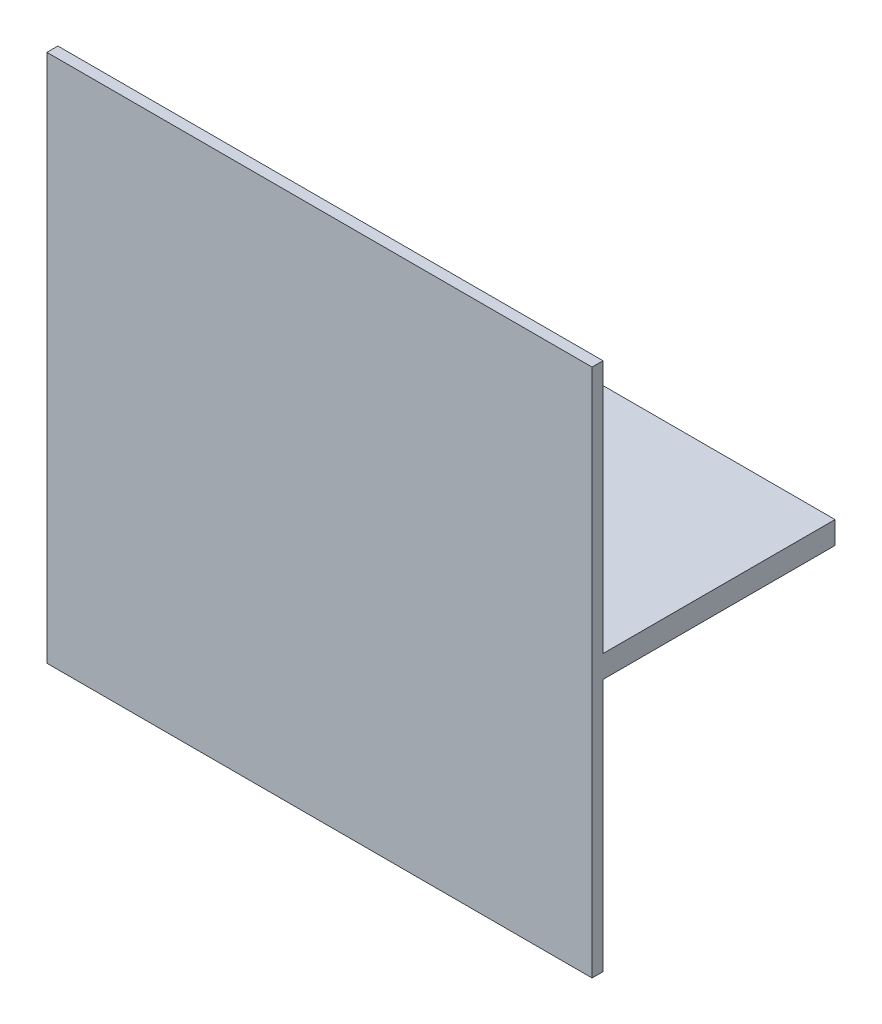
ISO-10303-21;
HEADER;
FILE_DESCRIPTION(('STEP AP214'),'2;1');
FILE_NAME('part.step','',(''),(''),'','','');
FILE_SCHEMA(('AUTOMOTIVE_DESIGN { 1 0 10303 214 1 1 1 1 }'));
ENDSEC;
DATA;
#1=APPLICATION_CONTEXT('core data for automotive mechanical design processes');
#2=APPLICATION_PROTOCOL_DEFINITION('international standard','automotive_design',2000,#1);
#3=PRODUCT_CONTEXT('',#1,'mechanical');
#4=PRODUCT('Part','Part','',(#3));
#5=PRODUCT_RELATED_PRODUCT_CATEGORY('part','',(#4));
#6=PRODUCT_DEFINITION_FORMATION('','',#4);
#7=PRODUCT_DEFINITION_CONTEXT('part definition',#1,'design');
#8=PRODUCT_DEFINITION('design','',#6,#7);
#9=PRODUCT_DEFINITION_SHAPE('','',#8);
#10=(LENGTH_UNIT() NAMED_UNIT(*) SI_UNIT(.MILLI.,.METRE.));
#11=(NAMED_UNIT(*) PLANE_ANGLE_UNIT() SI_UNIT($,.RADIAN.));
#12=(NAMED_UNIT(*) SI_UNIT($,.STERADIAN.) SOLID_ANGLE_UNIT());
#13=UNCERTAINTY_MEASURE_WITH_UNIT(LENGTH_MEASURE(1.E-05),#10,'distance_accuracy_value','');
#14=(GEOMETRIC_REPRESENTATION_CONTEXT(3) GLOBAL_UNCERTAINTY_ASSIGNED_CONTEXT((#13)) GLOBAL_UNIT_ASSIGNED_CONTEXT((#10,
#11,#12)) REPRESENTATION_CONTEXT('',''));
#15=CARTESIAN_POINT('',(0.,0.,0.));
#16=DIRECTION('',(0.,0.,1.));
#17=DIRECTION('',(1.,0.,0.));
#18=AXIS2_PLACEMENT_3D('',#15,#16,#17);
#19=CARTESIAN_POINT('',(-1101.60894308943,241.3,-165.746666666667));
#20=DIRECTION('',(0.,0.,1.));
#21=DIRECTION('',(1.,0.,0.));
#22=AXIS2_PLACEMENT_3D('',#19,#20,#21);
#23=PLANE('',#22);
#24=DIRECTION('',(-1.,0.,0.));
#25=VECTOR('',#24,1.);
#26=CARTESIAN_POINT('',(-1101.60894308943,115.412342914901,-165.746666666667));
#27=LINE('',#26,#25);
#28=CARTESIAN_POINT('',(-852.988943089431,115.412342914901,-165.746666666667));
#29=VERTEX_POINT('',#28);
#30=CARTESIAN_POINT('',(-1101.60894308943,115.412342914901,-165.746666666667));
#31=VERTEX_POINT('',#30);
#32=EDGE_CURVE('E63',#29,#31,#27,.T.);
#33=ORIENTED_EDGE('',*,*,#32,.F.);
#34=DIRECTION('',(0.,-1.,0.));
#35=VECTOR('',#34,1.);
#36=CARTESIAN_POINT('',(-852.988943089431,241.3,-165.746666666667));
#37=LINE('',#36,#35);
#38=CARTESIAN_POINT('',(-852.988943089431,0.,-165.746666666667));
#39=VERTEX_POINT('',#38);
#40=EDGE_CURVE('E249',#29,#39,#37,.T.);
#41=ORIENTED_EDGE('',*,*,#40,.T.);
#42=DIRECTION('',(-1.,0.,0.));
#43=VECTOR('',#42,1.);
#44=CARTESIAN_POINT('',(-1101.60894308943,0.,-165.746666666667));
#45=LINE('',#44,#43);
#46=CARTESIAN_POINT('',(-1101.60894308943,0.,-165.746666666667));
#47=VERTEX_POINT('',#46);
#48=EDGE_CURVE('E222',#39,#47,#45,.T.);
#49=ORIENTED_EDGE('',*,*,#48,.T.);
#50=DIRECTION('',(0.,-1.,0.));
#51=VECTOR('',#50,1.);
#52=CARTESIAN_POINT('',(-1101.60894308943,241.3,-165.746666666667));
#53=LINE('',#52,#51);
#54=EDGE_CURVE('E231',#31,#47,#53,.T.);
#55=ORIENTED_EDGE('',*,*,#54,.F.);
#56=EDGE_LOOP('',(#33,#41,#49,#55));
#57=FACE_BOUND('',#56,.T.);
#58=ADVANCED_FACE('F39',(#57),#23,.F.);
#59=DIRECTION('',(1.,0.,0.));
#60=VECTOR('',#59,1.);
#61=CARTESIAN_POINT('',(-1101.60894308943,125.65,-165.746666666667));
#62=LINE('',#61,#60);
#63=CARTESIAN_POINT('',(-1101.60894308943,125.65,-165.746666666667));
#64=VERTEX_POINT('',#63);
#65=CARTESIAN_POINT('',(-852.988943089431,125.65,-165.746666666667));
#66=VERTEX_POINT('',#65);
#67=EDGE_CURVE('E149',#64,#66,#62,.T.);
#68=ORIENTED_EDGE('',*,*,#67,.F.);
#69=CARTESIAN_POINT('',(-1101.60894308943,241.3,-165.746666666667));
#70=VERTEX_POINT('',#69);
#71=EDGE_CURVE('E245',#70,#64,#53,.T.);
#72=ORIENTED_EDGE('',*,*,#71,.F.);
#73=DIRECTION('',(-1.,0.,0.));
#74=VECTOR('',#73,1.);
#75=CARTESIAN_POINT('',(-1101.60894308943,241.3,-165.746666666667));
#76=LINE('',#75,#74);
#77=CARTESIAN_POINT('',(-852.988943089431,241.3,-165.746666666667));
#78=VERTEX_POINT('',#77);
#79=EDGE_CURVE('E228',#78,#70,#76,.T.);
#80=ORIENTED_EDGE('',*,*,#79,.F.);
#81=EDGE_CURVE('E250',#78,#66,#37,.T.);
#82=ORIENTED_EDGE('',*,*,#81,.T.);
#83=EDGE_LOOP('',(#68,#72,#80,#82));
#84=FACE_BOUND('',#83,.T.);
#85=ADVANCED_FACE('F283',(#84),#23,.F.);
#86=CARTESIAN_POINT('',(-1101.60894308943,241.3,-160.746666666667));
#87=DIRECTION('',(1.,0.,0.));
#88=DIRECTION('',(0.,0.,-1.));
#89=AXIS2_PLACEMENT_3D('',#86,#87,#88);
#90=PLANE('',#89);
#91=DIRECTION('',(0.,0.,1.));
#92=VECTOR('',#91,1.);
#93=CARTESIAN_POINT('',(-1101.60894308943,0.,-160.746666666667));
#94=LINE('',#93,#92);
#95=CARTESIAN_POINT('',(-1101.60894308943,0.,-160.746666666667));
#96=VERTEX_POINT('',#95);
#97=EDGE_CURVE('E216',#47,#96,#94,.T.);
#98=ORIENTED_EDGE('',*,*,#97,.T.);
#99=DIRECTION('',(0.,-1.,0.));
#100=VECTOR('',#99,1.);
#101=CARTESIAN_POINT('',(-1101.60894308943,241.3,-160.746666666667));
#102=LINE('',#101,#100);
#103=CARTESIAN_POINT('',(-1101.60894308943,241.3,-160.746666666667));
#104=VERTEX_POINT('',#103);
#105=EDGE_CURVE('E11',#104,#96,#102,.T.);
#106=ORIENTED_EDGE('',*,*,#105,.F.);
#107=DIRECTION('',(0.,0.,1.));
#108=VECTOR('',#107,1.);
#109=CARTESIAN_POINT('',(-1101.60894308943,241.3,-160.746666666667));
#110=LINE('',#109,#108);
#111=EDGE_CURVE('E217',#70,#104,#110,.T.);
#112=ORIENTED_EDGE('',*,*,#111,.F.);
#113=ORIENTED_EDGE('',*,*,#71,.T.);
#114=DIRECTION('',(0.,0.,1.));
#115=VECTOR('',#114,1.);
#116=CARTESIAN_POINT('',(-1101.60894308943,125.65,-271.586666666667));
#117=LINE('',#116,#115);
#118=CARTESIAN_POINT('',(-1101.60894308943,125.65,-271.586666666667));
#119=VERTEX_POINT('',#118);
#120=EDGE_CURVE('E212',#119,#64,#117,.T.);
#121=ORIENTED_EDGE('',*,*,#120,.F.);
#122=DIRECTION('',(0.,1.,0.));
#123=VECTOR('',#122,1.);
#124=CARTESIAN_POINT('',(-1101.60894308943,125.65,-271.586666666667));
#125=LINE('',#124,#123);
#126=CARTESIAN_POINT('',(-1101.60894308943,115.412342914901,-271.586666666667));
#127=VERTEX_POINT('',#126);
#128=EDGE_CURVE('E182',#127,#119,#125,.T.);
#129=ORIENTED_EDGE('',*,*,#128,.F.);
#130=DIRECTION('',(0.,0.,1.));
#131=VECTOR('',#130,1.);
#132=CARTESIAN_POINT('',(-1101.60894308943,115.412342914901,-271.586666666667));
#133=LINE('',#132,#131);
#134=EDGE_CURVE('E195',#127,#31,#133,.T.);
#135=ORIENTED_EDGE('',*,*,#134,.T.);
#136=ORIENTED_EDGE('',*,*,#54,.T.);
#137=EDGE_LOOP('',(#98,#106,#112,#113,#121,#129,#135,#136));
#138=FACE_BOUND('',#137,.T.);
#139=ADVANCED_FACE('F41',(#138),#90,.F.);
#140=CARTESIAN_POINT('',(-1101.60894308943,241.3,-160.746666666667));
#141=DIRECTION('',(0.,0.,-1.));
#142=DIRECTION('',(-1.,0.,0.));
#143=AXIS2_PLACEMENT_3D('',#140,#141,#142);
#144=PLANE('',#143);
#145=DIRECTION('',(1.,0.,0.));
#146=VECTOR('',#145,1.);
#147=CARTESIAN_POINT('',(-1101.60894308943,0.,-160.746666666667));
#148=LINE('',#147,#146);
#149=CARTESIAN_POINT('',(-852.988943089431,0.,-160.746666666667));
#150=VERTEX_POINT('',#149);
#151=EDGE_CURVE('E235',#96,#150,#148,.T.);
#152=ORIENTED_EDGE('',*,*,#151,.T.);
#153=DIRECTION('',(0.,-1.,0.));
#154=VECTOR('',#153,1.);
#155=CARTESIAN_POINT('',(-852.988943089431,241.3,-160.746666666667));
#156=LINE('',#155,#154);
#157=CARTESIAN_POINT('',(-852.988943089431,241.3,-160.746666666667));
#158=VERTEX_POINT('',#157);
#159=EDGE_CURVE('E48',#158,#150,#156,.T.);
#160=ORIENTED_EDGE('',*,*,#159,.F.);
#161=DIRECTION('',(1.,0.,0.));
#162=VECTOR('',#161,1.);
#163=CARTESIAN_POINT('',(-1101.60894308943,241.3,-160.746666666667));
#164=LINE('',#163,#162);
#165=EDGE_CURVE('E221',#104,#158,#164,.T.);
#166=ORIENTED_EDGE('',*,*,#165,.F.);
#167=ORIENTED_EDGE('',*,*,#105,.T.);
#168=EDGE_LOOP('',(#152,#160,#166,#167));
#169=FACE_BOUND('',#168,.T.);
#170=ADVANCED_FACE('F288',(#169),#144,.F.);
#171=CARTESIAN_POINT('',(-852.988943089431,241.3,-160.746666666667));
#172=DIRECTION('',(-1.,0.,0.));
#173=DIRECTION('',(0.,0.,1.));
#174=AXIS2_PLACEMENT_3D('',#171,#172,#173);
#175=PLANE('',#174);
#176=DIRECTION('',(0.,0.,-1.));
#177=VECTOR('',#176,1.);
#178=CARTESIAN_POINT('',(-852.988943089431,0.,-160.746666666667));
#179=LINE('',#178,#177);
#180=EDGE_CURVE('E238',#150,#39,#179,.T.);
#181=ORIENTED_EDGE('',*,*,#180,.T.);
#182=ORIENTED_EDGE('',*,*,#40,.F.);
#183=DIRECTION('',(0.,0.,1.));
#184=VECTOR('',#183,1.);
#185=CARTESIAN_POINT('',(-852.988943089431,115.412342914901,-271.586666666667));
#186=LINE('',#185,#184);
#187=CARTESIAN_POINT('',(-852.988943089431,115.412342914901,-271.586666666667));
#188=VERTEX_POINT('',#187);
#189=EDGE_CURVE('E204',#188,#29,#186,.T.);
#190=ORIENTED_EDGE('',*,*,#189,.F.);
#191=DIRECTION('',(0.,-1.,0.));
#192=VECTOR('',#191,1.);
#193=CARTESIAN_POINT('',(-852.988943089431,125.65,-271.586666666667));
#194=LINE('',#193,#192);
#195=CARTESIAN_POINT('',(-852.988943089431,125.65,-271.586666666667));
#196=VERTEX_POINT('',#195);
#197=EDGE_CURVE('E189',#196,#188,#194,.T.);
#198=ORIENTED_EDGE('',*,*,#197,.F.);
#199=DIRECTION('',(0.,0.,1.));
#200=VECTOR('',#199,1.);
#201=CARTESIAN_POINT('',(-852.988943089431,125.65,-271.586666666667));
#202=LINE('',#201,#200);
#203=EDGE_CURVE('E208',#196,#66,#202,.T.);
#204=ORIENTED_EDGE('',*,*,#203,.T.);
#205=ORIENTED_EDGE('',*,*,#81,.F.);
#206=DIRECTION('',(0.,0.,-1.));
#207=VECTOR('',#206,1.);
#208=CARTESIAN_POINT('',(-852.988943089431,241.3,-160.746666666667));
#209=LINE('',#208,#207);
#210=EDGE_CURVE('E225',#158,#78,#209,.T.);
#211=ORIENTED_EDGE('',*,*,#210,.F.);
#212=ORIENTED_EDGE('',*,*,#159,.T.);
#213=EDGE_LOOP('',(#181,#182,#190,#198,#204,#205,#211,#212));
#214=FACE_BOUND('',#213,.T.);
#215=ADVANCED_FACE('F258',(#214),#175,.F.);
#216=CARTESIAN_POINT('',(0.,241.3,0.));
#217=DIRECTION('',(0.,-1.,0.));
#218=DIRECTION('',(0.,0.,-1.));
#219=AXIS2_PLACEMENT_3D('',#216,#217,#218);
#220=PLANE('',#219);
#221=ORIENTED_EDGE('',*,*,#111,.T.);
#222=ORIENTED_EDGE('',*,*,#165,.T.);
#223=ORIENTED_EDGE('',*,*,#210,.T.);
#224=ORIENTED_EDGE('',*,*,#79,.T.);
#225=EDGE_LOOP('',(#221,#222,#223,#224));
#226=FACE_BOUND('',#225,.T.);
#227=ADVANCED_FACE('F287',(#226),#220,.F.);
#228=CARTESIAN_POINT('',(0.,0.,0.));
#229=DIRECTION('',(0.,-1.,0.));
#230=DIRECTION('',(0.,0.,-1.));
#231=AXIS2_PLACEMENT_3D('',#228,#229,#230);
#232=PLANE('',#231);
#233=ORIENTED_EDGE('',*,*,#97,.F.);
#234=ORIENTED_EDGE('',*,*,#48,.F.);
#235=ORIENTED_EDGE('',*,*,#180,.F.);
#236=ORIENTED_EDGE('',*,*,#151,.F.);
#237=EDGE_LOOP('',(#233,#234,#235,#236));
#238=FACE_BOUND('',#237,.T.);
#239=ADVANCED_FACE('F264',(#238),#232,.T.);
#240=CARTESIAN_POINT('',(0.,0.,-271.586666666667));
#241=DIRECTION('',(0.,0.,1.));
#242=DIRECTION('',(1.,0.,0.));
#243=AXIS2_PLACEMENT_3D('',#240,#241,#242);
#244=PLANE('',#243);
#245=ORIENTED_EDGE('',*,*,#128,.T.);
#246=DIRECTION('',(1.,0.,0.));
#247=VECTOR('',#246,1.);
#248=CARTESIAN_POINT('',(-1101.60894308943,125.65,-271.586666666667));
#249=LINE('',#248,#247);
#250=EDGE_CURVE('E186',#119,#196,#249,.T.);
#251=ORIENTED_EDGE('',*,*,#250,.T.);
#252=ORIENTED_EDGE('',*,*,#197,.T.);
#253=DIRECTION('',(-1.,0.,0.));
#254=VECTOR('',#253,1.);
#255=CARTESIAN_POINT('',(-1101.60894308943,115.412342914901,-271.586666666667));
#256=LINE('',#255,#254);
#257=EDGE_CURVE('E192',#188,#127,#256,.T.);
#258=ORIENTED_EDGE('',*,*,#257,.T.);
#259=EDGE_LOOP('',(#245,#251,#252,#258));
#260=FACE_BOUND('',#259,.T.);
#261=DIRECTION('',(0.,1.,0.));
#262=VECTOR('',#261,1.);
#263=CARTESIAN_POINT('',(-1091.60894308943,122.15,-271.586666666667));
#264=LINE('',#263,#262);
#265=CARTESIAN_POINT('',(-1091.60894308943,118.912342914901,-271.586666666667));
#266=VERTEX_POINT('',#265);
#267=CARTESIAN_POINT('',(-1091.60894308943,122.15,-271.586666666667));
#268=VERTEX_POINT('',#267);
#269=EDGE_CURVE('E131',#266,#268,#264,.T.);
#270=ORIENTED_EDGE('',*,*,#269,.F.);
#271=DIRECTION('',(-1.,0.,0.));
#272=VECTOR('',#271,1.);
#273=CARTESIAN_POINT('',(-1091.60894308943,118.912342914901,-271.586666666667));
#274=LINE('',#273,#272);
#275=CARTESIAN_POINT('',(-862.988943089431,118.912342914901,-271.586666666667));
#276=VERTEX_POINT('',#275);
#277=EDGE_CURVE('E159',#276,#266,#274,.T.);
#278=ORIENTED_EDGE('',*,*,#277,.F.);
#279=DIRECTION('',(0.,-1.,0.));
#280=VECTOR('',#279,1.);
#281=CARTESIAN_POINT('',(-862.988943089431,122.15,-271.586666666667));
#282=LINE('',#281,#280);
#283=CARTESIAN_POINT('',(-862.988943089431,122.15,-271.586666666667));
#284=VERTEX_POINT('',#283);
#285=EDGE_CURVE('E155',#284,#276,#282,.T.);
#286=ORIENTED_EDGE('',*,*,#285,.F.);
#287=DIRECTION('',(1.,0.,0.));
#288=VECTOR('',#287,1.);
#289=CARTESIAN_POINT('',(-1091.60894308943,122.15,-271.586666666667));
#290=LINE('',#289,#288);
#291=EDGE_CURVE('E141',#268,#284,#290,.T.);
#292=ORIENTED_EDGE('',*,*,#291,.F.);
#293=EDGE_LOOP('',(#270,#278,#286,#292));
#294=FACE_BOUND('',#293,.T.);
#295=ADVANCED_FACE('F153',(#260,#294),#244,.F.);
#296=CARTESIAN_POINT('',(-1101.60894308943,125.65,-271.586666666667));
#297=DIRECTION('',(0.,-1.,0.));
#298=DIRECTION('',(0.,0.,-1.));
#299=AXIS2_PLACEMENT_3D('',#296,#297,#298);
#300=PLANE('',#299);
#301=ORIENTED_EDGE('',*,*,#67,.T.);
#302=ORIENTED_EDGE('',*,*,#203,.F.);
#303=ORIENTED_EDGE('',*,*,#250,.F.);
#304=ORIENTED_EDGE('',*,*,#120,.T.);
#305=EDGE_LOOP('',(#301,#302,#303,#304));
#306=FACE_BOUND('',#305,.T.);
#307=ADVANCED_FACE('F280',(#306),#300,.F.);
#308=CARTESIAN_POINT('',(-1101.60894308943,115.412342914901,-271.586666666667));
#309=DIRECTION('',(0.,1.,0.));
#310=DIRECTION('',(0.,0.,1.));
#311=AXIS2_PLACEMENT_3D('',#308,#309,#310);
#312=PLANE('',#311);
#313=ORIENTED_EDGE('',*,*,#32,.T.);
#314=ORIENTED_EDGE('',*,*,#134,.F.);
#315=ORIENTED_EDGE('',*,*,#257,.F.);
#316=ORIENTED_EDGE('',*,*,#189,.T.);
#317=EDGE_LOOP('',(#313,#314,#315,#316));
#318=FACE_BOUND('',#317,.T.);
#319=ADVANCED_FACE('F275',(#318),#312,.F.);
#320=CARTESIAN_POINT('',(-1091.60894308943,122.15,-271.586666666667));
#321=DIRECTION('',(1.,0.,0.));
#322=DIRECTION('',(0.,0.,-1.));
#323=AXIS2_PLACEMENT_3D('',#320,#321,#322);
#324=PLANE('',#323);
#325=DIRECTION('',(0.,1.,0.));
#326=VECTOR('',#325,1.);
#327=CARTESIAN_POINT('',(-1091.60894308943,122.15,-165.746666666667));
#328=LINE('',#327,#326);
#329=CARTESIAN_POINT('',(-1091.60894308943,118.912342914901,-165.746666666667));
#330=VERTEX_POINT('',#329);
#331=CARTESIAN_POINT('',(-1091.60894308943,122.15,-165.746666666667));
#332=VERTEX_POINT('',#331);
#333=EDGE_CURVE('E164',#330,#332,#328,.T.);
#334=ORIENTED_EDGE('',*,*,#333,.F.);
#335=DIRECTION('',(0.,0.,1.));
#336=VECTOR('',#335,1.);
#337=CARTESIAN_POINT('',(-1091.60894308943,118.912342914901,-271.586666666667));
#338=LINE('',#337,#336);
#339=EDGE_CURVE('E136',#266,#330,#338,.T.);
#340=ORIENTED_EDGE('',*,*,#339,.F.);
#341=ORIENTED_EDGE('',*,*,#269,.T.);
#342=DIRECTION('',(0.,0.,1.));
#343=VECTOR('',#342,1.);
#344=CARTESIAN_POINT('',(-1091.60894308943,122.15,-271.586666666667));
#345=LINE('',#344,#343);
#346=EDGE_CURVE('E134',#268,#332,#345,.T.);
#347=ORIENTED_EDGE('',*,*,#346,.T.);
#348=EDGE_LOOP('',(#334,#340,#341,#347));
#349=FACE_BOUND('',#348,.T.);
#350=ADVANCED_FACE('F133',(#349),#324,.T.);
#351=CARTESIAN_POINT('',(-1091.60894308943,122.15,-271.586666666667));
#352=DIRECTION('',(0.,-1.,0.));
#353=DIRECTION('',(0.,0.,-1.));
#354=AXIS2_PLACEMENT_3D('',#351,#352,#353);
#355=PLANE('',#354);
#356=DIRECTION('',(1.,0.,0.));
#357=VECTOR('',#356,1.);
#358=CARTESIAN_POINT('',(-1091.60894308943,122.15,-165.746666666667));
#359=LINE('',#358,#357);
#360=CARTESIAN_POINT('',(-862.988943089431,122.15,-165.746666666667));
#361=VERTEX_POINT('',#360);
#362=EDGE_CURVE('E147',#332,#361,#359,.T.);
#363=ORIENTED_EDGE('',*,*,#362,.F.);
#364=ORIENTED_EDGE('',*,*,#346,.F.);
#365=ORIENTED_EDGE('',*,*,#291,.T.);
#366=DIRECTION('',(0.,0.,1.));
#367=VECTOR('',#366,1.);
#368=CARTESIAN_POINT('',(-862.988943089431,122.15,-271.586666666667));
#369=LINE('',#368,#367);
#370=EDGE_CURVE('E150',#284,#361,#369,.T.);
#371=ORIENTED_EDGE('',*,*,#370,.T.);
#372=EDGE_LOOP('',(#363,#364,#365,#371));
#373=FACE_BOUND('',#372,.T.);
#374=ADVANCED_FACE('F144',(#373),#355,.T.);
#375=CARTESIAN_POINT('',(-862.988943089431,122.15,-271.586666666667));
#376=DIRECTION('',(-1.,0.,0.));
#377=DIRECTION('',(0.,0.,1.));
#378=AXIS2_PLACEMENT_3D('',#375,#376,#377);
#379=PLANE('',#378);
#380=DIRECTION('',(0.,-1.,0.));
#381=VECTOR('',#380,1.);
#382=CARTESIAN_POINT('',(-862.988943089431,122.15,-165.746666666667));
#383=LINE('',#382,#381);
#384=CARTESIAN_POINT('',(-862.988943089431,118.912342914901,-165.746666666667));
#385=VERTEX_POINT('',#384);
#386=EDGE_CURVE('E169',#361,#385,#383,.T.);
#387=ORIENTED_EDGE('',*,*,#386,.F.);
#388=ORIENTED_EDGE('',*,*,#370,.F.);
#389=ORIENTED_EDGE('',*,*,#285,.T.);
#390=DIRECTION('',(0.,0.,1.));
#391=VECTOR('',#390,1.);
#392=CARTESIAN_POINT('',(-862.988943089431,118.912342914901,-271.586666666667));
#393=LINE('',#392,#391);
#394=EDGE_CURVE('E177',#276,#385,#393,.T.);
#395=ORIENTED_EDGE('',*,*,#394,.T.);
#396=EDGE_LOOP('',(#387,#388,#389,#395));
#397=FACE_BOUND('',#396,.T.);
#398=ADVANCED_FACE('F308',(#397),#379,.T.);
#399=CARTESIAN_POINT('',(-1091.60894308943,118.912342914901,-271.586666666667));
#400=DIRECTION('',(0.,1.,0.));
#401=DIRECTION('',(0.,0.,1.));
#402=AXIS2_PLACEMENT_3D('',#399,#400,#401);
#403=PLANE('',#402);
#404=DIRECTION('',(-1.,0.,0.));
#405=VECTOR('',#404,1.);
#406=CARTESIAN_POINT('',(-1091.60894308943,118.912342914901,-165.746666666667));
#407=LINE('',#406,#405);
#408=EDGE_CURVE('E55',#385,#330,#407,.T.);
#409=ORIENTED_EDGE('',*,*,#408,.F.);
#410=ORIENTED_EDGE('',*,*,#394,.F.);
#411=ORIENTED_EDGE('',*,*,#277,.T.);
#412=ORIENTED_EDGE('',*,*,#339,.T.);
#413=EDGE_LOOP('',(#409,#410,#411,#412));
#414=FACE_BOUND('',#413,.T.);
#415=ADVANCED_FACE('F303',(#414),#403,.T.);
#416=ORIENTED_EDGE('',*,*,#386,.T.);
#417=ORIENTED_EDGE('',*,*,#408,.T.);
#418=ORIENTED_EDGE('',*,*,#333,.T.);
#419=ORIENTED_EDGE('',*,*,#362,.T.);
#420=EDGE_LOOP('',(#416,#417,#418,#419));
#421=FACE_BOUND('',#420,.T.);
#422=ADVANCED_FACE('F297',(#421),#23,.F.);
#423=CLOSED_SHELL('',(#58,#85,#139,#170,#215,#227,#239,#295,#307,#319,#350,#374,#398,#415,#422));
#424=MANIFOLD_SOLID_BREP('B2',#423);
#425=ADVANCED_BREP_SHAPE_REPRESENTATION('',(#18,#424),#14);
#426=SHAPE_DEFINITION_REPRESENTATION(#9,#425);
ENDSEC;
END-ISO-10303-21;
